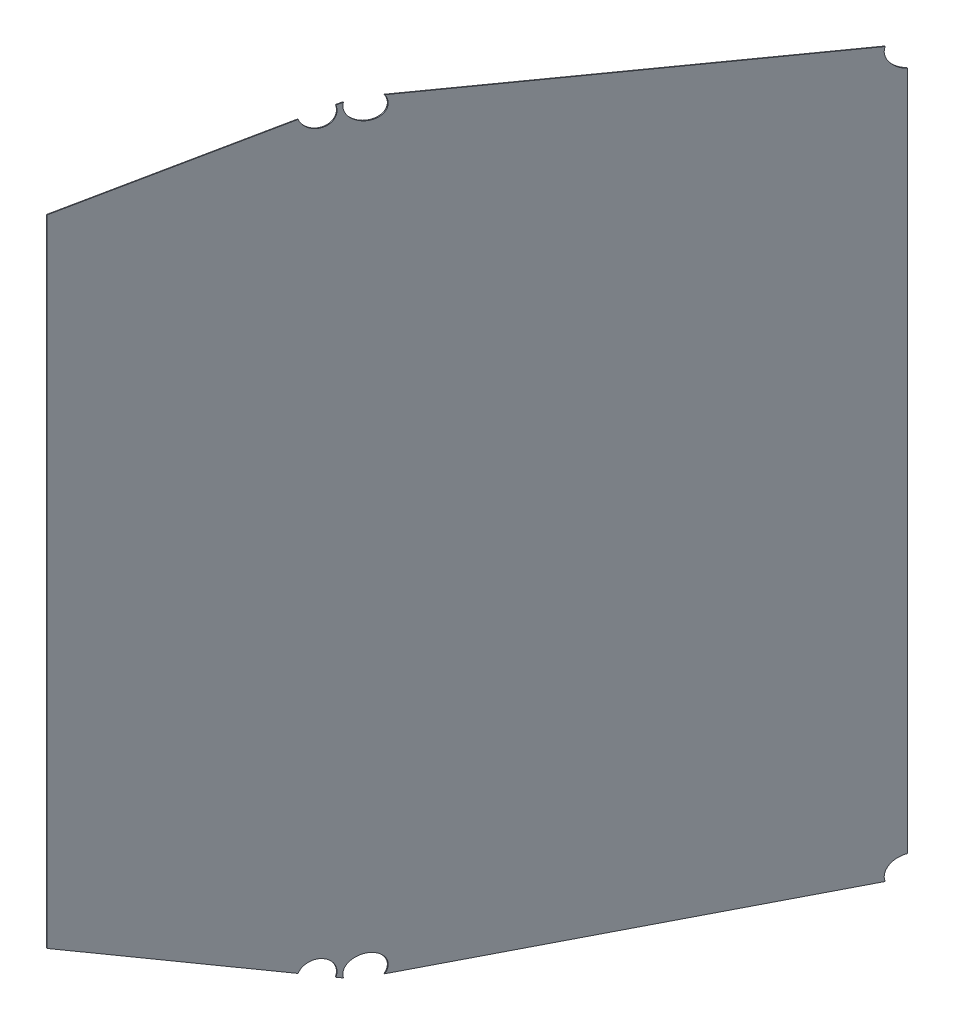
ISO-10303-21;
HEADER;
FILE_DESCRIPTION(('STEP AP214'),'2;1');
FILE_NAME('part.step','',(''),(''),'','','');
FILE_SCHEMA(('AUTOMOTIVE_DESIGN { 1 0 10303 214 1 1 1 1 }'));
ENDSEC;
DATA;
#1=APPLICATION_CONTEXT('core data for automotive mechanical design processes');
#2=APPLICATION_PROTOCOL_DEFINITION('international standard','automotive_design',2000,#1);
#3=PRODUCT_CONTEXT('',#1,'mechanical');
#4=PRODUCT('Part','Part','',(#3));
#5=PRODUCT_RELATED_PRODUCT_CATEGORY('part','',(#4));
#6=PRODUCT_DEFINITION_FORMATION('','',#4);
#7=PRODUCT_DEFINITION_CONTEXT('part definition',#1,'design');
#8=PRODUCT_DEFINITION('design','',#6,#7);
#9=PRODUCT_DEFINITION_SHAPE('','',#8);
#10=(LENGTH_UNIT() NAMED_UNIT(*) SI_UNIT(.MILLI.,.METRE.));
#11=(NAMED_UNIT(*) PLANE_ANGLE_UNIT() SI_UNIT($,.RADIAN.));
#12=(NAMED_UNIT(*) SI_UNIT($,.STERADIAN.) SOLID_ANGLE_UNIT());
#13=UNCERTAINTY_MEASURE_WITH_UNIT(LENGTH_MEASURE(1.E-05),#10,'distance_accuracy_value','');
#14=(GEOMETRIC_REPRESENTATION_CONTEXT(3) GLOBAL_UNCERTAINTY_ASSIGNED_CONTEXT((#13)) GLOBAL_UNIT_ASSIGNED_CONTEXT((#10,
#11,#12)) REPRESENTATION_CONTEXT('',''));
#15=CARTESIAN_POINT('',(0.,0.,0.));
#16=DIRECTION('',(0.,0.,1.));
#17=DIRECTION('',(1.,0.,0.));
#18=AXIS2_PLACEMENT_3D('',#15,#16,#17);
#19=CARTESIAN_POINT('',(297.627887551756,-346.121290027363,296.962439256937));
#20=DIRECTION('',(-0.142851044700198,-0.961526085177984,0.234651159277689));
#21=DIRECTION('',(0.,-0.237082631619164,-0.971489488252205));
#22=AXIS2_PLACEMENT_3D('',#19,#20,#21);
#23=PLANE('',#22);
#24=DIRECTION('',(-0.499993384276965,0.274713646407129,0.821303249815174));
#25=VECTOR('',#24,1.);
#26=CARTESIAN_POINT('',(297.085491904179,-346.121290027363,296.632239375821));
#27=LINE('',#26,#25);
#28=CARTESIAN_POINT('',(295.055296985631,-345.00583077024,299.967094869505));
#29=VERTEX_POINT('',#28);
#30=CARTESIAN_POINT('',(206.435241805539,-296.314909512294,445.536899604944));
#31=VERTEX_POINT('',#30);
#32=EDGE_CURVE('E149',#29,#31,#27,.T.);
#33=ORIENTED_EDGE('',*,*,#32,.F.);
#34=CARTESIAN_POINT('',(302.004069082359,-348.680600709539,289.139329057124));
#35=DIRECTION('',(-0.142851044700198,-0.961526085177984,0.234651159277689));
#36=DIRECTION('',(-0.953565841320189,0.0701910856819254,-0.292891443641005));
#37=AXIS2_PLACEMENT_3D('',#34,#35,#36);
#38=ELLIPSE('',#37,49.9186004740371,12.8905);
#39=CARTESIAN_POINT('',(295.675664326708,-345.048671113556,300.169216245427));
#40=VERTEX_POINT('',#39);
#41=EDGE_CURVE('E48',#29,#40,#38,.F.);
#42=ORIENTED_EDGE('',*,*,#41,.T.);
#43=DIRECTION('',(-0.499993384276965,0.274713646407129,0.821303249815174));
#44=VECTOR('',#43,1.);
#45=CARTESIAN_POINT('',(297.627887551756,-346.121290027363,296.962439256937));
#46=LINE('',#45,#44);
#47=CARTESIAN_POINT('',(206.977637453116,-296.314909512294,445.867099486061));
#48=VERTEX_POINT('',#47);
#49=EDGE_CURVE('E243',#40,#48,#46,.T.);
#50=ORIENTED_EDGE('',*,*,#49,.T.);
#51=DIRECTION('',(-0.854166374137573,0.,-0.519999812781381));
#52=VECTOR('',#51,1.);
#53=CARTESIAN_POINT('',(206.977637453116,-296.314909512294,445.867099486061));
#54=LINE('',#53,#52);
#55=EDGE_CURVE('E162',#48,#31,#54,.T.);
#56=ORIENTED_EDGE('',*,*,#55,.T.);
#57=EDGE_LOOP('',(#33,#42,#50,#56));
#58=FACE_BOUND('',#57,.T.);
#59=ADVANCED_FACE('F34',(#58),#23,.T.);
#60=CARTESIAN_POINT('',(297.627887551756,346.121290027363,296.962439256937));
#61=DIRECTION('',(0.142851044700198,-0.961526085177984,-0.234651159277689));
#62=DIRECTION('',(0.,0.237082631619164,-0.971489488252205));
#63=AXIS2_PLACEMENT_3D('',#60,#61,#62);
#64=PLANE('',#63);
#65=DIRECTION('',(-0.499993384276965,-0.274713646407129,0.821303249815174));
#66=VECTOR('',#65,1.);
#67=CARTESIAN_POINT('',(297.085491904179,346.121290027363,296.63223937582));
#68=LINE('',#67,#66);
#69=CARTESIAN_POINT('',(310.929480629491,353.727655917682,273.89171262476));
#70=VERTEX_POINT('',#69);
#71=CARTESIAN_POINT('',(308.356975602864,352.314232743518,278.117382013547));
#72=VERTEX_POINT('',#71);
#73=EDGE_CURVE('E248',#70,#72,#68,.T.);
#74=ORIENTED_EDGE('',*,*,#73,.T.);
#75=CARTESIAN_POINT('',(302.004069082359,348.680600709539,289.139329057124));
#76=DIRECTION('',(0.142851044700198,-0.961526085177984,-0.234651159277689));
#77=DIRECTION('',(-0.953565841320189,-0.0701910856819254,-0.292891443641005));
#78=AXIS2_PLACEMENT_3D('',#75,#76,#77);
#79=ELLIPSE('',#78,49.9186004740371,12.8905);
#80=CARTESIAN_POINT('',(308.977297718532,352.357048238431,278.319577678003));
#81=VERTEX_POINT('',#80);
#82=EDGE_CURVE('E217',#72,#81,#79,.T.);
#83=ORIENTED_EDGE('',*,*,#82,.T.);
#84=DIRECTION('',(-0.499993384276965,-0.274713646407129,0.821303249815174));
#85=VECTOR('',#84,1.);
#86=CARTESIAN_POINT('',(297.627887551756,346.121290027363,296.962439256937));
#87=LINE('',#86,#85);
#88=CARTESIAN_POINT('',(311.728077716689,353.868421843604,273.801068787571));
#89=VERTEX_POINT('',#88);
#90=EDGE_CURVE('E237',#89,#81,#87,.T.);
#91=ORIENTED_EDGE('',*,*,#90,.F.);
#92=CARTESIAN_POINT('',(291.243160233538,353.713997919117,261.963031251143));
#93=DIRECTION('',(0.142851044700198,-0.961526085177984,-0.234651159277689));
#94=DIRECTION('',(-0.989720643123852,-0.137139305521998,-0.0405691934286767));
#95=AXIS2_PLACEMENT_3D('',#92,#93,#94);
#96=ELLIPSE('',#95,43.4426567316473,12.8905);
#97=EDGE_CURVE('E223',#89,#70,#96,.T.);
#98=ORIENTED_EDGE('',*,*,#97,.T.);
#99=EDGE_LOOP('',(#74,#83,#91,#98));
#100=FACE_BOUND('',#99,.T.);
#101=ADVANCED_FACE('F271',(#100),#64,.F.);
#102=CARTESIAN_POINT('',(295.675664326708,345.048671113556,300.169216245427));
#103=VERTEX_POINT('',#102);
#104=CARTESIAN_POINT('',(206.977637453116,296.314909512294,445.867099486061));
#105=VERTEX_POINT('',#104);
#106=EDGE_CURVE('E161',#103,#105,#87,.T.);
#107=ORIENTED_EDGE('',*,*,#106,.F.);
#108=CARTESIAN_POINT('',(295.055296985631,345.00583077024,299.967094869505));
#109=VERTEX_POINT('',#108);
#110=EDGE_CURVE('E214',#103,#109,#79,.T.);
#111=ORIENTED_EDGE('',*,*,#110,.T.);
#112=CARTESIAN_POINT('',(206.435241805539,296.314909512294,445.536899604944));
#113=VERTEX_POINT('',#112);
#114=EDGE_CURVE('E236',#109,#113,#68,.T.);
#115=ORIENTED_EDGE('',*,*,#114,.T.);
#116=DIRECTION('',(-0.854166374137573,0.,-0.519999812781381));
#117=VECTOR('',#116,1.);
#118=CARTESIAN_POINT('',(206.977637453116,296.314909512294,445.867099486061));
#119=LINE('',#118,#117);
#120=EDGE_CURVE('E165',#105,#113,#119,.T.);
#121=ORIENTED_EDGE('',*,*,#120,.F.);
#122=EDGE_LOOP('',(#107,#111,#115,#121));
#123=FACE_BOUND('',#122,.T.);
#124=ADVANCED_FACE('F36',(#123),#64,.F.);
#125=CARTESIAN_POINT('',(206.977637453116,0.,445.867099486061));
#126=DIRECTION('',(0.519999812781381,0.,-0.854166374137573));
#127=DIRECTION('',(-0.854166374137573,0.,-0.519999812781381));
#128=AXIS2_PLACEMENT_3D('',#125,#126,#127);
#129=PLANE('',#128);
#130=DIRECTION('',(0.,-1.,0.));
#131=VECTOR('',#130,1.);
#132=CARTESIAN_POINT('',(206.435241805539,0.,445.536899604944));
#133=LINE('',#132,#131);
#134=EDGE_CURVE('E153',#113,#31,#133,.T.);
#135=ORIENTED_EDGE('',*,*,#134,.T.);
#136=ORIENTED_EDGE('',*,*,#55,.F.);
#137=DIRECTION('',(0.,-1.,0.));
#138=VECTOR('',#137,1.);
#139=CARTESIAN_POINT('',(206.977637453116,0.,445.867099486061));
#140=LINE('',#139,#138);
#141=EDGE_CURVE('E240',#105,#48,#140,.T.);
#142=ORIENTED_EDGE('',*,*,#141,.F.);
#143=ORIENTED_EDGE('',*,*,#120,.T.);
#144=EDGE_LOOP('',(#135,#136,#142,#143));
#145=FACE_BOUND('',#144,.T.);
#146=ADVANCED_FACE('F262',(#145),#129,.F.);
#147=CARTESIAN_POINT('',(311.728077716689,-353.868421843605,273.801068787571));
#148=VERTEX_POINT('',#147);
#149=CARTESIAN_POINT('',(308.977297718532,-352.357048238431,278.319577678003));
#150=VERTEX_POINT('',#149);
#151=EDGE_CURVE('E144',#148,#150,#46,.T.);
#152=ORIENTED_EDGE('',*,*,#151,.T.);
#153=CARTESIAN_POINT('',(308.356975602864,-352.314232743518,278.117382013547));
#154=VERTEX_POINT('',#153);
#155=EDGE_CURVE('E133',#150,#154,#38,.F.);
#156=ORIENTED_EDGE('',*,*,#155,.T.);
#157=CARTESIAN_POINT('',(310.929480629491,-353.727655917682,273.89171262476));
#158=VERTEX_POINT('',#157);
#159=EDGE_CURVE('E142',#158,#154,#27,.T.);
#160=ORIENTED_EDGE('',*,*,#159,.F.);
#161=CARTESIAN_POINT('',(291.243160233538,-353.713997919117,261.963031251143));
#162=DIRECTION('',(-0.142851044700198,-0.961526085177984,0.234651159277689));
#163=DIRECTION('',(-0.989720643123852,0.137139305521998,-0.0405691934286767));
#164=AXIS2_PLACEMENT_3D('',#161,#162,#163);
#165=ELLIPSE('',#164,43.4426567316473,12.8905);
#166=EDGE_CURVE('E56',#158,#148,#165,.F.);
#167=ORIENTED_EDGE('',*,*,#166,.T.);
#168=EDGE_LOOP('',(#152,#156,#160,#167));
#169=FACE_BOUND('',#168,.T.);
#170=ADVANCED_FACE('F141',(#169),#23,.T.);
#171=CARTESIAN_POINT('',(358.639575737006,-351.881493409303,196.74291764123));
#172=DIRECTION('',(0.0272146874480635,-0.998629534754574,-0.044703613981055));
#173=DIRECTION('',(0.,0.0447201778072238,-0.998999552400746));
#174=AXIS2_PLACEMENT_3D('',#171,#172,#173);
#175=PLANE('',#174);
#176=DIRECTION('',(-0.519287171110336,-0.0523359562429403,0.852995768808006));
#177=VECTOR('',#176,1.);
#178=CARTESIAN_POINT('',(358.639575737006,-351.881493409303,196.74291764123));
#179=LINE('',#178,#177);
#180=CARTESIAN_POINT('',(502.97182645726,-337.335079058282,-40.34131246534));
#181=VERTEX_POINT('',#180);
#182=CARTESIAN_POINT('',(326.243532135801,-355.146503628469,249.957573529727));
#183=VERTEX_POINT('',#182);
#184=EDGE_CURVE('E189',#181,#183,#179,.T.);
#185=ORIENTED_EDGE('',*,*,#184,.T.);
#186=CARTESIAN_POINT('',(268.337150331449,-357.29406274601,262.679405831595));
#187=DIRECTION('',(0.0272146874480635,-0.998629534754574,-0.044703613981055));
#188=DIRECTION('',(-0.998905379930991,-0.0288697614839897,0.0368046032009488));
#189=AXIS2_PLACEMENT_3D('',#186,#187,#188);
#190=ELLIPSE('',#189,102.404921043513,12.8905);
#191=CARTESIAN_POINT('',(325.521855396881,-355.164572334714,249.921865831069));
#192=VERTEX_POINT('',#191);
#193=EDGE_CURVE('E181',#183,#192,#190,.F.);
#194=ORIENTED_EDGE('',*,*,#193,.T.);
#195=DIRECTION('',(-0.519287171110336,-0.0523359562429403,0.852995768808006));
#196=VECTOR('',#195,1.);
#197=CARTESIAN_POINT('',(358.097180089429,-351.881493409303,196.412717760114));
#198=LINE('',#197,#196);
#199=CARTESIAN_POINT('',(502.188995600585,-337.359311135026,-40.2765666835502));
#200=VERTEX_POINT('',#199);
#201=EDGE_CURVE('E148',#200,#192,#198,.T.);
#202=ORIENTED_EDGE('',*,*,#201,.F.);
#203=CARTESIAN_POINT('',(490.070631516643,-337.137621183772,-52.6062996675774));
#204=DIRECTION('',(0.0272146874480635,-0.998629534754574,-0.044703613981055));
#205=DIRECTION('',(-0.99953734174407,-0.0277925532543197,0.012356230930321));
#206=AXIS2_PLACEMENT_3D('',#203,#204,#205);
#207=ELLIPSE('',#206,48.3852502541207,12.8905);
#208=EDGE_CURVE('E199',#200,#181,#207,.F.);
#209=ORIENTED_EDGE('',*,*,#208,.T.);
#210=EDGE_LOOP('',(#185,#194,#202,#209));
#211=FACE_BOUND('',#210,.T.);
#212=ADVANCED_FACE('F186',(#211),#175,.T.);
#213=CARTESIAN_POINT('',(510.761528079999,0.,-53.1368962851096));
#214=DIRECTION('',(-0.519999812781381,0.,0.854166374137573));
#215=DIRECTION('',(0.854166374137573,0.,0.519999812781381));
#216=AXIS2_PLACEMENT_3D('',#213,#214,#215);
#217=PLANE('',#216);
#218=CARTESIAN_POINT('',(511.63310106481,-330.533842631242,-52.6062996675774));
#219=DIRECTION('',(-0.519999812781381,0.,0.854166374137573));
#220=DIRECTION('',(-0.804044903435811,-0.33751211354612,-0.489486839933955));
#221=AXIS2_PLACEMENT_3D('',#218,#219,#220);
#222=ELLIPSE('',#221,25.9259631508701,12.8905);
#223=CARTESIAN_POINT('',(510.219132432422,-317.515484633386,-53.4670961662258));
#224=VERTEX_POINT('',#223);
#225=CARTESIAN_POINT('',(510.761528079999,-317.330702545691,-53.1368962851096));
#226=VERTEX_POINT('',#225);
#227=EDGE_CURVE('E197',#224,#226,#222,.F.);
#228=ORIENTED_EDGE('',*,*,#227,.F.);
#229=DIRECTION('',(0.,1.,0.));
#230=VECTOR('',#229,1.);
#231=CARTESIAN_POINT('',(510.219132432422,0.,-53.4670961662258));
#232=LINE('',#231,#230);
#233=CARTESIAN_POINT('',(510.219132432422,317.515484633386,-53.4670961662258));
#234=VERTEX_POINT('',#233);
#235=EDGE_CURVE('E151',#224,#234,#232,.T.);
#236=ORIENTED_EDGE('',*,*,#235,.T.);
#237=CARTESIAN_POINT('',(511.63310106481,330.533842631242,-52.6062996675774));
#238=DIRECTION('',(-0.519999812781381,0.,0.854166374137573));
#239=DIRECTION('',(-0.804044903435811,0.33751211354612,-0.489486839933955));
#240=AXIS2_PLACEMENT_3D('',#237,#238,#239);
#241=ELLIPSE('',#240,25.9259631508701,12.8905);
#242=CARTESIAN_POINT('',(510.761528079999,317.330702545691,-53.1368962851096));
#243=VERTEX_POINT('',#242);
#244=EDGE_CURVE('E231',#234,#243,#241,.T.);
#245=ORIENTED_EDGE('',*,*,#244,.T.);
#246=DIRECTION('',(0.,1.,0.));
#247=VECTOR('',#246,1.);
#248=CARTESIAN_POINT('',(510.761528079999,0.,-53.1368962851096));
#249=LINE('',#248,#247);
#250=EDGE_CURVE('E205',#226,#243,#249,.T.);
#251=ORIENTED_EDGE('',*,*,#250,.F.);
#252=EDGE_LOOP('',(#228,#236,#245,#251));
#253=FACE_BOUND('',#252,.T.);
#254=ADVANCED_FACE('F202',(#253),#217,.F.);
#255=CARTESIAN_POINT('',(358.639575737006,351.881493409303,196.74291764123));
#256=DIRECTION('',(-0.0272146874480635,-0.998629534754574,0.044703613981055));
#257=DIRECTION('',(0.,-0.0447201778072238,-0.998999552400746));
#258=AXIS2_PLACEMENT_3D('',#255,#256,#257);
#259=PLANE('',#258);
#260=DIRECTION('',(-0.519287171110336,0.0523359562429403,0.852995768808006));
#261=VECTOR('',#260,1.);
#262=CARTESIAN_POINT('',(358.097180089429,351.881493409303,196.412717760114));
#263=LINE('',#262,#261);
#264=CARTESIAN_POINT('',(502.188995600585,337.359311135026,-40.27656668355));
#265=VERTEX_POINT('',#264);
#266=CARTESIAN_POINT('',(325.521855396881,355.164572334714,249.921865831069));
#267=VERTEX_POINT('',#266);
#268=EDGE_CURVE('E158',#265,#267,#263,.T.);
#269=ORIENTED_EDGE('',*,*,#268,.T.);
#270=CARTESIAN_POINT('',(268.337150331449,357.29406274601,262.679405831595));
#271=DIRECTION('',(-0.0272146874480635,-0.998629534754574,0.044703613981055));
#272=DIRECTION('',(-0.998905379930991,0.0288697614839897,0.0368046032009488));
#273=AXIS2_PLACEMENT_3D('',#270,#271,#272);
#274=ELLIPSE('',#273,102.404921043513,12.8905);
#275=CARTESIAN_POINT('',(326.243532135801,355.146503628469,249.957573529727));
#276=VERTEX_POINT('',#275);
#277=EDGE_CURVE('E220',#267,#276,#274,.T.);
#278=ORIENTED_EDGE('',*,*,#277,.T.);
#279=DIRECTION('',(-0.519287171110336,0.0523359562429403,0.852995768808006));
#280=VECTOR('',#279,1.);
#281=CARTESIAN_POINT('',(358.639575737006,351.881493409303,196.74291764123));
#282=LINE('',#281,#280);
#283=CARTESIAN_POINT('',(502.97182645726,337.335079058282,-40.34131246534));
#284=VERTEX_POINT('',#283);
#285=EDGE_CURVE('E166',#284,#276,#282,.T.);
#286=ORIENTED_EDGE('',*,*,#285,.F.);
#287=CARTESIAN_POINT('',(490.070631516643,337.137621183772,-52.6062996675774));
#288=DIRECTION('',(-0.0272146874480635,-0.998629534754574,0.044703613981055));
#289=DIRECTION('',(-0.99953734174407,0.0277925532543197,0.012356230930321));
#290=AXIS2_PLACEMENT_3D('',#287,#288,#289);
#291=ELLIPSE('',#290,48.3852502541207,12.8905);
#292=EDGE_CURVE('E228',#284,#265,#291,.T.);
#293=ORIENTED_EDGE('',*,*,#292,.T.);
#294=EDGE_LOOP('',(#269,#278,#286,#293));
#295=FACE_BOUND('',#294,.T.);
#296=ADVANCED_FACE('F275',(#295),#259,.F.);
#297=CARTESIAN_POINT('',(349.050088816568,0.,212.494879606097));
#298=DIRECTION('',(0.854166374137573,0.,0.519999812781381));
#299=DIRECTION('',(0.519999812781381,0.,-0.854166374137573));
#300=AXIS2_PLACEMENT_3D('',#297,#298,#299);
#301=PLANE('',#300);
#302=ORIENTED_EDGE('',*,*,#49,.F.);
#303=CARTESIAN_POINT('',(302.342611998333,-348.616827558469,289.217899765568));
#304=DIRECTION('',(0.854166374137573,0.,0.519999812781381));
#305=DIRECTION('',(-0.448750535725368,-0.505234477758224,0.737130299994899));
#306=AXIS2_PLACEMENT_3D('',#303,#304,#305);
#307=ELLIPSE('',#306,13.8011477967056,12.8905);
#308=EDGE_CURVE('E190',#40,#150,#307,.F.);
#309=ORIENTED_EDGE('',*,*,#308,.T.);
#310=ORIENTED_EDGE('',*,*,#151,.F.);
#311=CARTESIAN_POINT('',(319.472307634822,-349.301960286353,261.080178073634));
#312=DIRECTION('',(0.854166374137573,0.,0.519999812781381));
#313=DIRECTION('',(-0.499970563472394,-0.274867206132338,0.821265763717263));
#314=AXIS2_PLACEMENT_3D('',#311,#312,#313);
#315=ELLIPSE('',#314,15.5784261762808,12.8905);
#316=EDGE_CURVE('E206',#148,#183,#315,.F.);
#317=ORIENTED_EDGE('',*,*,#316,.T.);
#318=ORIENTED_EDGE('',*,*,#184,.F.);
#319=CARTESIAN_POINT('',(510.438511218023,-330.899700855026,-52.6062996675774));
#320=DIRECTION('',(0.854166374137573,0.,0.519999812781381));
#321=DIRECTION('',(-0.448062327049526,-0.507488327748628,0.735999828993095));
#322=AXIS2_PLACEMENT_3D('',#319,#320,#321);
#323=ELLIPSE('',#322,15.7832202166015,12.8905);
#324=EDGE_CURVE('E208',#181,#226,#323,.F.);
#325=ORIENTED_EDGE('',*,*,#324,.T.);
#326=ORIENTED_EDGE('',*,*,#250,.T.);
#327=CARTESIAN_POINT('',(510.438511218023,330.899700855026,-52.6062996675774));
#328=DIRECTION('',(0.854166374137573,0.,0.519999812781381));
#329=DIRECTION('',(-0.448062327049526,0.507488327748628,0.735999828993095));
#330=AXIS2_PLACEMENT_3D('',#327,#328,#329);
#331=ELLIPSE('',#330,15.7832202166015,12.8905);
#332=EDGE_CURVE('E233',#284,#243,#331,.T.);
#333=ORIENTED_EDGE('',*,*,#332,.F.);
#334=ORIENTED_EDGE('',*,*,#285,.T.);
#335=CARTESIAN_POINT('',(319.472307634822,349.301960286353,261.080178073634));
#336=DIRECTION('',(0.854166374137573,0.,0.519999812781381));
#337=DIRECTION('',(-0.499970563472394,0.274867206132338,0.821265763717263));
#338=AXIS2_PLACEMENT_3D('',#335,#336,#337);
#339=ELLIPSE('',#338,15.5784261762808,12.8905);
#340=EDGE_CURVE('E226',#89,#276,#339,.T.);
#341=ORIENTED_EDGE('',*,*,#340,.F.);
#342=ORIENTED_EDGE('',*,*,#90,.T.);
#343=CARTESIAN_POINT('',(302.342611998333,348.616827558469,289.217899765568));
#344=DIRECTION('',(0.854166374137573,0.,0.519999812781381));
#345=DIRECTION('',(-0.448750535725367,0.505234477758224,0.737130299994899));
#346=AXIS2_PLACEMENT_3D('',#343,#344,#345);
#347=ELLIPSE('',#346,13.8011477967056,12.8905);
#348=EDGE_CURVE('E218',#103,#81,#347,.T.);
#349=ORIENTED_EDGE('',*,*,#348,.F.);
#350=ORIENTED_EDGE('',*,*,#106,.T.);
#351=ORIENTED_EDGE('',*,*,#141,.T.);
#352=EDGE_LOOP('',(#302,#309,#310,#317,#318,#325,#326,#333,#334,#341,#342,#349,#350,#351));
#353=FACE_BOUND('',#352,.T.);
#354=ADVANCED_FACE('F265',(#353),#301,.T.);
#355=CARTESIAN_POINT('',(348.507693168991,0.,212.164679724981));
#356=DIRECTION('',(0.854166374137573,0.,0.519999812781381));
#357=DIRECTION('',(0.519999812781381,0.,-0.854166374137573));
#358=AXIS2_PLACEMENT_3D('',#355,#356,#357);
#359=PLANE('',#358);
#360=CARTESIAN_POINT('',(301.691230064145,-348.739531879054,289.066723835953));
#361=DIRECTION('',(0.854166374137573,0.,0.519999812781381));
#362=DIRECTION('',(-0.448750535725368,-0.505234477758224,0.737130299994899));
#363=AXIS2_PLACEMENT_3D('',#360,#361,#362);
#364=ELLIPSE('',#363,13.8011477967056,12.8905);
#365=EDGE_CURVE('E11',#29,#154,#364,.F.);
#366=ORIENTED_EDGE('',*,*,#365,.F.);
#367=ORIENTED_EDGE('',*,*,#32,.T.);
#368=ORIENTED_EDGE('',*,*,#134,.F.);
#369=ORIENTED_EDGE('',*,*,#114,.F.);
#370=CARTESIAN_POINT('',(301.691230064145,348.739531879054,289.066723835953));
#371=DIRECTION('',(0.854166374137573,0.,0.519999812781381));
#372=DIRECTION('',(-0.448750535725367,0.505234477758224,0.737130299994899));
#373=AXIS2_PLACEMENT_3D('',#370,#371,#372);
#374=ELLIPSE('',#373,13.8011477967056,12.8905);
#375=EDGE_CURVE('E175',#109,#72,#374,.T.);
#376=ORIENTED_EDGE('',*,*,#375,.T.);
#377=ORIENTED_EDGE('',*,*,#73,.F.);
#378=CARTESIAN_POINT('',(318.714463916806,349.420406478018,261.103879275976));
#379=DIRECTION('',(0.854166374137573,0.,0.519999812781381));
#380=DIRECTION('',(-0.499970563472394,0.274867206132338,0.821265763717263));
#381=AXIS2_PLACEMENT_3D('',#378,#379,#380);
#382=ELLIPSE('',#381,15.5784261762808,12.8905);
#383=EDGE_CURVE('E172',#70,#267,#382,.T.);
#384=ORIENTED_EDGE('',*,*,#383,.T.);
#385=ORIENTED_EDGE('',*,*,#268,.F.);
#386=CARTESIAN_POINT('',(509.695096329277,331.127381051256,-52.6062996675774));
#387=DIRECTION('',(0.854166374137573,0.,0.519999812781381));
#388=DIRECTION('',(-0.448062327049526,0.507488327748628,0.735999828993095));
#389=AXIS2_PLACEMENT_3D('',#386,#387,#388);
#390=ELLIPSE('',#389,15.7832202166015,12.8905);
#391=EDGE_CURVE('E169',#265,#234,#390,.T.);
#392=ORIENTED_EDGE('',*,*,#391,.T.);
#393=ORIENTED_EDGE('',*,*,#235,.F.);
#394=CARTESIAN_POINT('',(509.695096329277,-331.127381051256,-52.6062996675774));
#395=DIRECTION('',(0.854166374137573,0.,0.519999812781381));
#396=DIRECTION('',(-0.448062327049526,-0.507488327748628,0.735999828993095));
#397=AXIS2_PLACEMENT_3D('',#394,#395,#396);
#398=ELLIPSE('',#397,15.7832202166015,12.8905);
#399=EDGE_CURVE('E178',#200,#224,#398,.F.);
#400=ORIENTED_EDGE('',*,*,#399,.F.);
#401=ORIENTED_EDGE('',*,*,#201,.T.);
#402=CARTESIAN_POINT('',(318.714463916806,-349.420406478018,261.103879275976));
#403=DIRECTION('',(0.854166374137573,0.,0.519999812781381));
#404=DIRECTION('',(-0.499970563472394,-0.274867206132338,0.821265763717263));
#405=AXIS2_PLACEMENT_3D('',#402,#403,#404);
#406=ELLIPSE('',#405,15.5784261762808,12.8905);
#407=EDGE_CURVE('E42',#158,#192,#406,.F.);
#408=ORIENTED_EDGE('',*,*,#407,.F.);
#409=ORIENTED_EDGE('',*,*,#159,.T.);
#410=EDGE_LOOP('',(#366,#367,#368,#369,#376,#377,#384,#385,#392,#393,#400,#401,#408,#409));
#411=FACE_BOUND('',#410,.T.);
#412=ADVANCED_FACE('F146',(#411),#359,.F.);
#413=CARTESIAN_POINT('',(527.404446490594,325.703668961447,-52.6062996675774));
#414=DIRECTION('',(-0.956162432915219,0.292836817838277,0.));
#415=DIRECTION('',(-0.292836817838277,-0.95616243291522,0.));
#416=AXIS2_PLACEMENT_3D('',#413,#414,#415);
#417=CYLINDRICAL_SURFACE('',#416,12.8905);
#418=ORIENTED_EDGE('',*,*,#332,.T.);
#419=ORIENTED_EDGE('',*,*,#244,.F.);
#420=ORIENTED_EDGE('',*,*,#391,.F.);
#421=ORIENTED_EDGE('',*,*,#292,.F.);
#422=EDGE_LOOP('',(#418,#419,#420,#421));
#423=FACE_BOUND('',#422,.T.);
#424=ADVANCED_FACE('F279',(#423),#417,.F.);
#425=CARTESIAN_POINT('',(348.035492490059,344.837714707076,260.186878033403));
#426=DIRECTION('',(-0.987534125825098,0.154345353221032,0.0308846607547164));
#427=DIRECTION('',(-0.154419018029273,-0.988005448806268,0.));
#428=AXIS2_PLACEMENT_3D('',#425,#426,#427);
#429=CYLINDRICAL_SURFACE('',#428,12.8905);
#430=ORIENTED_EDGE('',*,*,#340,.T.);
#431=ORIENTED_EDGE('',*,*,#277,.F.);
#432=ORIENTED_EDGE('',*,*,#383,.F.);
#433=ORIENTED_EDGE('',*,*,#97,.F.);
#434=EDGE_LOOP('',(#430,#431,#432,#433));
#435=FACE_BOUND('',#434,.T.);
#436=ADVANCED_FACE('F310',(#435),#429,.F.);
#437=CARTESIAN_POINT('',(343.551648260765,340.854059616739,298.781895999598));
#438=DIRECTION('',(-0.958112575764111,0.180484822317733,-0.22236348862976));
#439=DIRECTION('',(-0.226076163467082,0.,0.974109628487474));
#440=AXIS2_PLACEMENT_3D('',#437,#438,#439);
#441=CYLINDRICAL_SURFACE('',#440,12.8905);
#442=ORIENTED_EDGE('',*,*,#348,.T.);
#443=ORIENTED_EDGE('',*,*,#82,.F.);
#444=ORIENTED_EDGE('',*,*,#375,.F.);
#445=ORIENTED_EDGE('',*,*,#110,.F.);
#446=EDGE_LOOP('',(#442,#443,#444,#445));
#447=FACE_BOUND('',#446,.T.);
#448=ADVANCED_FACE('F270',(#447),#441,.F.);
#449=CARTESIAN_POINT('',(527.404446490594,-325.703668961447,-52.6062996675774));
#450=DIRECTION('',(-0.956162432915219,-0.292836817838277,0.));
#451=DIRECTION('',(0.292836817838277,-0.95616243291522,0.));
#452=AXIS2_PLACEMENT_3D('',#449,#450,#451);
#453=CYLINDRICAL_SURFACE('',#452,12.8905);
#454=ORIENTED_EDGE('',*,*,#208,.F.);
#455=ORIENTED_EDGE('',*,*,#399,.T.);
#456=ORIENTED_EDGE('',*,*,#227,.T.);
#457=ORIENTED_EDGE('',*,*,#324,.F.);
#458=EDGE_LOOP('',(#454,#455,#456,#457));
#459=FACE_BOUND('',#458,.T.);
#460=ADVANCED_FACE('F196',(#459),#453,.F.);
#461=CARTESIAN_POINT('',(348.035492490059,-344.837714707076,260.186878033403));
#462=DIRECTION('',(-0.987534125825098,-0.154345353221032,0.0308846607547164));
#463=DIRECTION('',(0.154419018029273,-0.988005448806268,0.));
#464=AXIS2_PLACEMENT_3D('',#461,#462,#463);
#465=CYLINDRICAL_SURFACE('',#464,12.8905);
#466=ORIENTED_EDGE('',*,*,#166,.F.);
#467=ORIENTED_EDGE('',*,*,#407,.T.);
#468=ORIENTED_EDGE('',*,*,#193,.F.);
#469=ORIENTED_EDGE('',*,*,#316,.F.);
#470=EDGE_LOOP('',(#466,#467,#468,#469));
#471=FACE_BOUND('',#470,.T.);
#472=ADVANCED_FACE('F180',(#471),#465,.F.);
#473=CARTESIAN_POINT('',(343.551648260765,-340.854059616739,298.781895999598));
#474=DIRECTION('',(-0.958112575764111,-0.180484822317733,-0.22236348862976));
#475=DIRECTION('',(-0.226076163467082,0.,0.974109628487474));
#476=AXIS2_PLACEMENT_3D('',#473,#474,#475);
#477=CYLINDRICAL_SURFACE('',#476,12.8905);
#478=ORIENTED_EDGE('',*,*,#41,.F.);
#479=ORIENTED_EDGE('',*,*,#365,.T.);
#480=ORIENTED_EDGE('',*,*,#155,.F.);
#481=ORIENTED_EDGE('',*,*,#308,.F.);
#482=EDGE_LOOP('',(#478,#479,#480,#481));
#483=FACE_BOUND('',#482,.T.);
#484=ADVANCED_FACE('F132',(#483),#477,.F.);
#485=CLOSED_SHELL('',(#59,#101,#124,#146,#170,#212,#254,#296,#354,#412,#424,#436,#448,#460,#472,#484));
#486=MANIFOLD_SOLID_BREP('B2',#485);
#487=ADVANCED_BREP_SHAPE_REPRESENTATION('',(#18,#486),#14);
#488=SHAPE_DEFINITION_REPRESENTATION(#9,#487);
ENDSEC;
END-ISO-10303-21;
